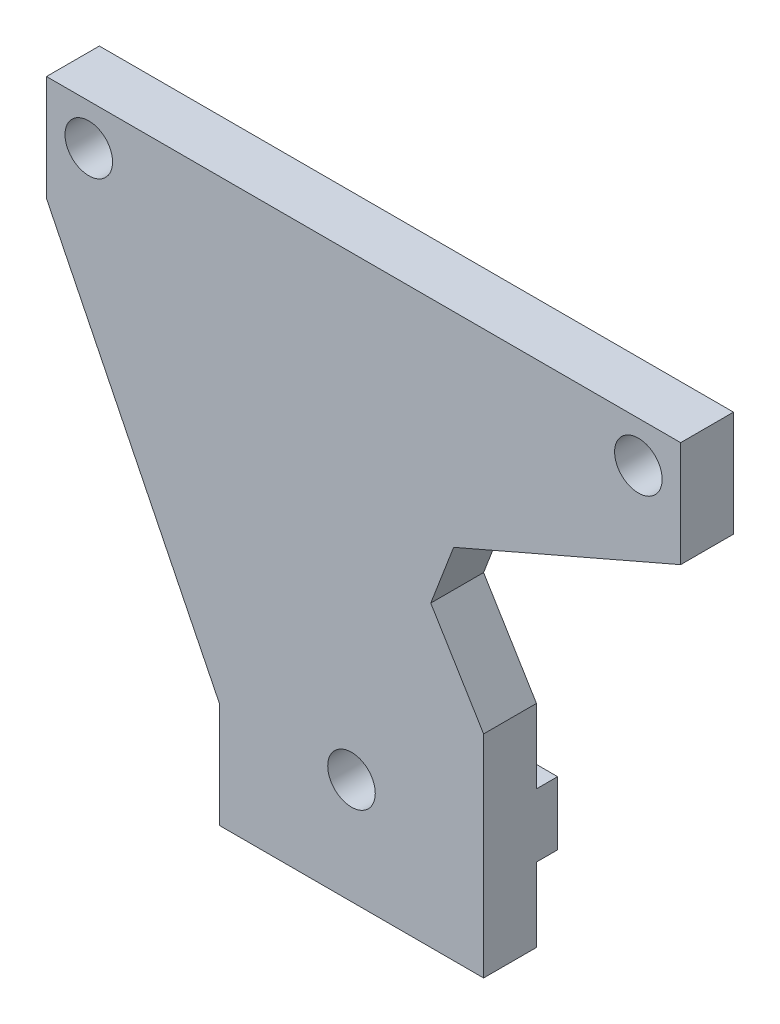
ISO-10303-21;
HEADER;
FILE_DESCRIPTION(('STEP AP214'),'2;1');
FILE_NAME('part.step','',(''),(''),'','','');
FILE_SCHEMA(('AUTOMOTIVE_DESIGN { 1 0 10303 214 1 1 1 1 }'));
ENDSEC;
DATA;
#1=APPLICATION_CONTEXT('core data for automotive mechanical design processes');
#2=APPLICATION_PROTOCOL_DEFINITION('international standard','automotive_design',2000,#1);
#3=PRODUCT_CONTEXT('',#1,'mechanical');
#4=PRODUCT('Part','Part','',(#3));
#5=PRODUCT_RELATED_PRODUCT_CATEGORY('part','',(#4));
#6=PRODUCT_DEFINITION_FORMATION('','',#4);
#7=PRODUCT_DEFINITION_CONTEXT('part definition',#1,'design');
#8=PRODUCT_DEFINITION('design','',#6,#7);
#9=PRODUCT_DEFINITION_SHAPE('','',#8);
#10=(LENGTH_UNIT() NAMED_UNIT(*) SI_UNIT(.MILLI.,.METRE.));
#11=(NAMED_UNIT(*) PLANE_ANGLE_UNIT() SI_UNIT($,.RADIAN.));
#12=(NAMED_UNIT(*) SI_UNIT($,.STERADIAN.) SOLID_ANGLE_UNIT());
#13=UNCERTAINTY_MEASURE_WITH_UNIT(LENGTH_MEASURE(1.E-05),#10,'distance_accuracy_value','');
#14=(GEOMETRIC_REPRESENTATION_CONTEXT(3) GLOBAL_UNCERTAINTY_ASSIGNED_CONTEXT((#13)) GLOBAL_UNIT_ASSIGNED_CONTEXT((#10,
#11,#12)) REPRESENTATION_CONTEXT('',''));
#15=CARTESIAN_POINT('',(0.,0.,0.));
#16=DIRECTION('',(0.,0.,1.));
#17=DIRECTION('',(1.,0.,0.));
#18=AXIS2_PLACEMENT_3D('',#15,#16,#17);
#19=CARTESIAN_POINT('',(0.,0.,0.));
#20=DIRECTION('',(0.,0.,1.));
#21=DIRECTION('',(1.,0.,0.));
#22=AXIS2_PLACEMENT_3D('',#19,#20,#21);
#23=PLANE('',#22);
#24=DIRECTION('',(-1.,0.,0.));
#25=VECTOR('',#24,1.);
#26=CARTESIAN_POINT('',(41.3569249684672,-46.1881154266996,0.));
#27=LINE('',#26,#25);
#28=CARTESIAN_POINT('',(41.3569249684672,-46.1881154266996,0.));
#29=VERTEX_POINT('',#28);
#30=CARTESIAN_POINT('',(16.3569249684672,-46.1881154266996,0.));
#31=VERTEX_POINT('',#30);
#32=EDGE_CURVE('E54',#29,#31,#27,.T.);
#33=ORIENTED_EDGE('',*,*,#32,.F.);
#34=DIRECTION('',(0.,1.,0.));
#35=VECTOR('',#34,1.);
#36=CARTESIAN_POINT('',(41.3569249684672,-53.1881154266996,0.));
#37=LINE('',#36,#35);
#38=CARTESIAN_POINT('',(41.3569249684672,-53.1881154266996,0.));
#39=VERTEX_POINT('',#38);
#40=EDGE_CURVE('E168',#39,#29,#37,.T.);
#41=ORIENTED_EDGE('',*,*,#40,.F.);
#42=DIRECTION('',(1.,0.,0.));
#43=VECTOR('',#42,1.);
#44=CARTESIAN_POINT('',(16.3569249684672,-53.1881154266996,0.));
#45=LINE('',#44,#43);
#46=CARTESIAN_POINT('',(16.3569249684672,-53.1881154266996,0.));
#47=VERTEX_POINT('',#46);
#48=EDGE_CURVE('E165',#47,#39,#45,.T.);
#49=ORIENTED_EDGE('',*,*,#48,.F.);
#50=DIRECTION('',(0.,-1.,0.));
#51=VECTOR('',#50,1.);
#52=CARTESIAN_POINT('',(16.3569249684672,-43.1881154266996,0.));
#53=LINE('',#52,#51);
#54=EDGE_CURVE('E163',#31,#47,#53,.T.);
#55=ORIENTED_EDGE('',*,*,#54,.F.);
#56=EDGE_LOOP('',(#33,#41,#49,#55));
#57=FACE_BOUND('',#56,.T.);
#58=ADVANCED_FACE('F37',(#57),#23,.F.);
#59=CARTESIAN_POINT('',(0.,0.,5.));
#60=DIRECTION('',(1.,0.,0.));
#61=DIRECTION('',(0.,0.,-1.));
#62=AXIS2_PLACEMENT_3D('',#59,#60,#61);
#63=PLANE('',#62);
#64=DIRECTION('',(0.,-1.,0.));
#65=VECTOR('',#64,1.);
#66=CARTESIAN_POINT('',(0.,0.,0.));
#67=LINE('',#66,#65);
#68=CARTESIAN_POINT('',(0.,0.,0.));
#69=VERTEX_POINT('',#68);
#70=CARTESIAN_POINT('',(0.,-10.,0.));
#71=VERTEX_POINT('',#70);
#72=EDGE_CURVE('E156',#69,#71,#67,.T.);
#73=ORIENTED_EDGE('',*,*,#72,.T.);
#74=DIRECTION('',(0.,0.,-1.));
#75=VECTOR('',#74,1.);
#76=CARTESIAN_POINT('',(0.,-10.,5.));
#77=LINE('',#76,#75);
#78=CARTESIAN_POINT('',(0.,-10.,5.));
#79=VERTEX_POINT('',#78);
#80=EDGE_CURVE('E11',#79,#71,#77,.T.);
#81=ORIENTED_EDGE('',*,*,#80,.F.);
#82=DIRECTION('',(0.,-1.,0.));
#83=VECTOR('',#82,1.);
#84=CARTESIAN_POINT('',(0.,0.,5.));
#85=LINE('',#84,#83);
#86=CARTESIAN_POINT('',(0.,0.,5.));
#87=VERTEX_POINT('',#86);
#88=EDGE_CURVE('E179',#87,#79,#85,.T.);
#89=ORIENTED_EDGE('',*,*,#88,.F.);
#90=DIRECTION('',(0.,0.,-1.));
#91=VECTOR('',#90,1.);
#92=CARTESIAN_POINT('',(0.,0.,5.));
#93=LINE('',#92,#91);
#94=EDGE_CURVE('E152',#87,#69,#93,.T.);
#95=ORIENTED_EDGE('',*,*,#94,.T.);
#96=EDGE_LOOP('',(#73,#81,#89,#95));
#97=FACE_BOUND('',#96,.T.);
#98=ADVANCED_FACE('F39',(#97),#63,.F.);
#99=CARTESIAN_POINT('',(0.,-10.,5.));
#100=DIRECTION('',(0.896976092613502,0.442079053201817,0.));
#101=DIRECTION('',(-0.442079053201817,0.896976092613502,0.));
#102=AXIS2_PLACEMENT_3D('',#99,#100,#101);
#103=PLANE('',#102);
#104=DIRECTION('',(0.442079053201817,-0.896976092613502,0.));
#105=VECTOR('',#104,1.);
#106=CARTESIAN_POINT('',(0.,-10.,0.));
#107=LINE('',#106,#105);
#108=CARTESIAN_POINT('',(16.3569249684672,-43.1881154266996,0.));
#109=VERTEX_POINT('',#108);
#110=EDGE_CURVE('E159',#71,#109,#107,.T.);
#111=ORIENTED_EDGE('',*,*,#110,.T.);
#112=DIRECTION('',(0.,0.,-1.));
#113=VECTOR('',#112,1.);
#114=CARTESIAN_POINT('',(16.3569249684672,-43.1881154266996,5.));
#115=LINE('',#114,#113);
#116=CARTESIAN_POINT('',(16.3569249684672,-43.1881154266996,5.));
#117=VERTEX_POINT('',#116);
#118=EDGE_CURVE('E46',#117,#109,#115,.T.);
#119=ORIENTED_EDGE('',*,*,#118,.F.);
#120=DIRECTION('',(0.442079053201817,-0.896976092613502,0.));
#121=VECTOR('',#120,1.);
#122=CARTESIAN_POINT('',(0.,-10.,5.));
#123=LINE('',#122,#121);
#124=EDGE_CURVE('E107',#79,#117,#123,.T.);
#125=ORIENTED_EDGE('',*,*,#124,.F.);
#126=ORIENTED_EDGE('',*,*,#80,.T.);
#127=EDGE_LOOP('',(#111,#119,#125,#126));
#128=FACE_BOUND('',#127,.T.);
#129=ADVANCED_FACE('F272',(#128),#103,.F.);
#130=CARTESIAN_POINT('',(16.3569249684672,-43.1881154266996,5.));
#131=DIRECTION('',(1.,0.,0.));
#132=DIRECTION('',(0.,0.,-1.));
#133=AXIS2_PLACEMENT_3D('',#130,#131,#132);
#134=PLANE('',#133);
#135=ORIENTED_EDGE('',*,*,#118,.T.);
#136=DIRECTION('',(0.,-1.,0.));
#137=VECTOR('',#136,1.);
#138=CARTESIAN_POINT('',(16.3569249684672,-40.1881154266996,0.));
#139=LINE('',#138,#137);
#140=CARTESIAN_POINT('',(16.3569249684672,-40.1881154266996,0.));
#141=VERTEX_POINT('',#140);
#142=EDGE_CURVE('E230',#141,#109,#139,.T.);
#143=ORIENTED_EDGE('',*,*,#142,.F.);
#144=DIRECTION('',(0.,0.,1.));
#145=VECTOR('',#144,1.);
#146=CARTESIAN_POINT('',(16.3569249684672,-40.1881154266996,-2.));
#147=LINE('',#146,#145);
#148=CARTESIAN_POINT('',(16.3569249684672,-40.1881154266996,-2.));
#149=VERTEX_POINT('',#148);
#150=EDGE_CURVE('E239',#149,#141,#147,.T.);
#151=ORIENTED_EDGE('',*,*,#150,.F.);
#152=DIRECTION('',(0.,-1.,0.));
#153=VECTOR('',#152,1.);
#154=CARTESIAN_POINT('',(16.3569249684672,-40.1881154266996,-2.));
#155=LINE('',#154,#153);
#156=CARTESIAN_POINT('',(16.3569249684672,-46.1881154266996,-2.));
#157=VERTEX_POINT('',#156);
#158=EDGE_CURVE('E218',#149,#157,#155,.T.);
#159=ORIENTED_EDGE('',*,*,#158,.T.);
#160=DIRECTION('',(0.,0.,1.));
#161=VECTOR('',#160,1.);
#162=CARTESIAN_POINT('',(16.3569249684672,-46.1881154266996,-2.));
#163=LINE('',#162,#161);
#164=EDGE_CURVE('E160',#157,#31,#163,.T.);
#165=ORIENTED_EDGE('',*,*,#164,.T.);
#166=ORIENTED_EDGE('',*,*,#54,.T.);
#167=DIRECTION('',(0.,0.,-1.));
#168=VECTOR('',#167,1.);
#169=CARTESIAN_POINT('',(16.3569249684672,-53.1881154266996,5.));
#170=LINE('',#169,#168);
#171=CARTESIAN_POINT('',(16.3569249684672,-53.1881154266996,5.));
#172=VERTEX_POINT('',#171);
#173=EDGE_CURVE('E192',#172,#47,#170,.T.);
#174=ORIENTED_EDGE('',*,*,#173,.F.);
#175=DIRECTION('',(0.,-1.,0.));
#176=VECTOR('',#175,1.);
#177=CARTESIAN_POINT('',(16.3569249684672,-43.1881154266996,5.));
#178=LINE('',#177,#176);
#179=EDGE_CURVE('E245',#117,#172,#178,.T.);
#180=ORIENTED_EDGE('',*,*,#179,.F.);
#181=EDGE_LOOP('',(#135,#143,#151,#159,#165,#166,#174,#180));
#182=FACE_BOUND('',#181,.T.);
#183=ADVANCED_FACE('F275',(#182),#134,.F.);
#184=CARTESIAN_POINT('',(16.3569249684672,-53.1881154266996,5.));
#185=DIRECTION('',(0.,1.,0.));
#186=DIRECTION('',(0.,0.,1.));
#187=AXIS2_PLACEMENT_3D('',#184,#185,#186);
#188=PLANE('',#187);
#189=ORIENTED_EDGE('',*,*,#48,.T.);
#190=DIRECTION('',(0.,0.,-1.));
#191=VECTOR('',#190,1.);
#192=CARTESIAN_POINT('',(41.3569249684672,-53.1881154266996,5.));
#193=LINE('',#192,#191);
#194=CARTESIAN_POINT('',(41.3569249684672,-53.1881154266996,5.));
#195=VERTEX_POINT('',#194);
#196=EDGE_CURVE('E189',#195,#39,#193,.T.);
#197=ORIENTED_EDGE('',*,*,#196,.F.);
#198=DIRECTION('',(1.,0.,0.));
#199=VECTOR('',#198,1.);
#200=CARTESIAN_POINT('',(16.3569249684672,-53.1881154266996,5.));
#201=LINE('',#200,#199);
#202=EDGE_CURVE('E247',#172,#195,#201,.T.);
#203=ORIENTED_EDGE('',*,*,#202,.F.);
#204=ORIENTED_EDGE('',*,*,#173,.T.);
#205=EDGE_LOOP('',(#189,#197,#203,#204));
#206=FACE_BOUND('',#205,.T.);
#207=ADVANCED_FACE('F281',(#206),#188,.F.);
#208=CARTESIAN_POINT('',(41.3569249684672,-53.1881154266996,5.));
#209=DIRECTION('',(-1.,0.,0.));
#210=DIRECTION('',(0.,0.,1.));
#211=AXIS2_PLACEMENT_3D('',#208,#209,#210);
#212=PLANE('',#211);
#213=ORIENTED_EDGE('',*,*,#40,.T.);
#214=DIRECTION('',(0.,0.,1.));
#215=VECTOR('',#214,1.);
#216=CARTESIAN_POINT('',(41.3569249684672,-46.1881154266996,-2.));
#217=LINE('',#216,#215);
#218=CARTESIAN_POINT('',(41.3569249684672,-46.1881154266996,-2.));
#219=VERTEX_POINT('',#218);
#220=EDGE_CURVE('E228',#219,#29,#217,.T.);
#221=ORIENTED_EDGE('',*,*,#220,.F.);
#222=DIRECTION('',(0.,-1.,0.));
#223=VECTOR('',#222,1.);
#224=CARTESIAN_POINT('',(41.3569249684672,-40.1881154266996,-2.));
#225=LINE('',#224,#223);
#226=CARTESIAN_POINT('',(41.3569249684672,-40.1881154266996,-2.));
#227=VERTEX_POINT('',#226);
#228=EDGE_CURVE('E225',#227,#219,#225,.T.);
#229=ORIENTED_EDGE('',*,*,#228,.F.);
#230=DIRECTION('',(0.,0.,1.));
#231=VECTOR('',#230,1.);
#232=CARTESIAN_POINT('',(41.3569249684672,-40.1881154266996,-2.));
#233=LINE('',#232,#231);
#234=CARTESIAN_POINT('',(41.3569249684672,-40.1881154266996,0.));
#235=VERTEX_POINT('',#234);
#236=EDGE_CURVE('E236',#227,#235,#233,.T.);
#237=ORIENTED_EDGE('',*,*,#236,.T.);
#238=CARTESIAN_POINT('',(41.3569249684672,-33.1881154266996,0.));
#239=VERTEX_POINT('',#238);
#240=EDGE_CURVE('E167',#235,#239,#37,.T.);
#241=ORIENTED_EDGE('',*,*,#240,.T.);
#242=DIRECTION('',(0.,0.,-1.));
#243=VECTOR('',#242,1.);
#244=CARTESIAN_POINT('',(41.3569249684672,-33.1881154266996,5.));
#245=LINE('',#244,#243);
#246=CARTESIAN_POINT('',(41.3569249684672,-33.1881154266996,5.));
#247=VERTEX_POINT('',#246);
#248=EDGE_CURVE('E186',#247,#239,#245,.T.);
#249=ORIENTED_EDGE('',*,*,#248,.F.);
#250=DIRECTION('',(0.,1.,0.));
#251=VECTOR('',#250,1.);
#252=CARTESIAN_POINT('',(41.3569249684672,-53.1881154266996,5.));
#253=LINE('',#252,#251);
#254=EDGE_CURVE('E249',#195,#247,#253,.T.);
#255=ORIENTED_EDGE('',*,*,#254,.F.);
#256=ORIENTED_EDGE('',*,*,#196,.T.);
#257=EDGE_LOOP('',(#213,#221,#229,#237,#241,#249,#255,#256));
#258=FACE_BOUND('',#257,.T.);
#259=ADVANCED_FACE('F284',(#258),#212,.F.);
#260=CARTESIAN_POINT('',(41.3569249684672,-33.1881154266996,5.));
#261=DIRECTION('',(-0.854310976073864,-0.519762211169417,0.));
#262=DIRECTION('',(0.519762211169417,-0.854310976073864,0.));
#263=AXIS2_PLACEMENT_3D('',#260,#261,#262);
#264=PLANE('',#263);
#265=DIRECTION('',(-0.519762211169417,0.854310976073864,0.));
#266=VECTOR('',#265,1.);
#267=CARTESIAN_POINT('',(41.3569249684672,-33.1881154266996,0.));
#268=LINE('',#267,#266);
#269=CARTESIAN_POINT('',(36.3557169880903,-24.9678431955744,0.));
#270=VERTEX_POINT('',#269);
#271=EDGE_CURVE('E171',#239,#270,#268,.T.);
#272=ORIENTED_EDGE('',*,*,#271,.T.);
#273=DIRECTION('',(0.,0.,-1.));
#274=VECTOR('',#273,1.);
#275=CARTESIAN_POINT('',(36.3557169880903,-24.9678431955744,5.));
#276=LINE('',#275,#274);
#277=CARTESIAN_POINT('',(36.3557169880903,-24.9678431955744,5.));
#278=VERTEX_POINT('',#277);
#279=EDGE_CURVE('E183',#278,#270,#276,.T.);
#280=ORIENTED_EDGE('',*,*,#279,.F.);
#281=DIRECTION('',(-0.519762211169417,0.854310976073864,0.));
#282=VECTOR('',#281,1.);
#283=CARTESIAN_POINT('',(41.3569249684672,-33.1881154266996,5.));
#284=LINE('',#283,#282);
#285=EDGE_CURVE('E251',#247,#278,#284,.T.);
#286=ORIENTED_EDGE('',*,*,#285,.F.);
#287=ORIENTED_EDGE('',*,*,#248,.T.);
#288=EDGE_LOOP('',(#272,#280,#286,#287));
#289=FACE_BOUND('',#288,.T.);
#290=ADVANCED_FACE('F257',(#289),#264,.F.);
#291=CARTESIAN_POINT('',(36.3557169880903,-24.9678431955744,5.));
#292=DIRECTION('',(-0.93374611730205,0.357936011632452,0.));
#293=DIRECTION('',(-0.357936011632452,-0.93374611730205,0.));
#294=AXIS2_PLACEMENT_3D('',#291,#292,#293);
#295=PLANE('',#294);
#296=DIRECTION('',(0.357936011632452,0.93374611730205,0.));
#297=VECTOR('',#296,1.);
#298=CARTESIAN_POINT('',(36.3557169880903,-24.9678431955744,0.));
#299=LINE('',#298,#297);
#300=CARTESIAN_POINT('',(38.5227399227401,-19.3147398877922,0.));
#301=VERTEX_POINT('',#300);
#302=EDGE_CURVE('E173',#270,#301,#299,.T.);
#303=ORIENTED_EDGE('',*,*,#302,.T.);
#304=DIRECTION('',(0.,0.,-1.));
#305=VECTOR('',#304,1.);
#306=CARTESIAN_POINT('',(38.5227399227401,-19.3147398877922,5.));
#307=LINE('',#306,#305);
#308=CARTESIAN_POINT('',(38.5227399227401,-19.3147398877922,5.));
#309=VERTEX_POINT('',#308);
#310=EDGE_CURVE('E147',#309,#301,#307,.T.);
#311=ORIENTED_EDGE('',*,*,#310,.F.);
#312=DIRECTION('',(0.357936011632452,0.93374611730205,0.));
#313=VECTOR('',#312,1.);
#314=CARTESIAN_POINT('',(36.3557169880903,-24.9678431955744,5.));
#315=LINE('',#314,#313);
#316=EDGE_CURVE('E135',#278,#309,#315,.T.);
#317=ORIENTED_EDGE('',*,*,#316,.F.);
#318=ORIENTED_EDGE('',*,*,#279,.T.);
#319=EDGE_LOOP('',(#303,#311,#317,#318));
#320=FACE_BOUND('',#319,.T.);
#321=ADVANCED_FACE('F261',(#320),#295,.F.);
#322=CARTESIAN_POINT('',(38.5227399227401,-19.3147398877922,5.));
#323=DIRECTION('',(-0.397892506464658,0.917432042877984,0.));
#324=DIRECTION('',(-0.917432042877985,-0.397892506464659,0.));
#325=AXIS2_PLACEMENT_3D('',#322,#323,#324);
#326=PLANE('',#325);
#327=DIRECTION('',(0.917432042877984,0.397892506464659,0.));
#328=VECTOR('',#327,1.);
#329=CARTESIAN_POINT('',(38.5227399227401,-19.3147398877922,0.));
#330=LINE('',#329,#328);
#331=CARTESIAN_POINT('',(60.,-10.,0.));
#332=VERTEX_POINT('',#331);
#333=EDGE_CURVE('E144',#301,#332,#330,.T.);
#334=ORIENTED_EDGE('',*,*,#333,.T.);
#335=DIRECTION('',(0.,0.,-1.));
#336=VECTOR('',#335,1.);
#337=CARTESIAN_POINT('',(60.,-10.,5.));
#338=LINE('',#337,#336);
#339=CARTESIAN_POINT('',(60.,-10.,5.));
#340=VERTEX_POINT('',#339);
#341=EDGE_CURVE('E141',#340,#332,#338,.T.);
#342=ORIENTED_EDGE('',*,*,#341,.F.);
#343=DIRECTION('',(0.917432042877984,0.397892506464659,0.));
#344=VECTOR('',#343,1.);
#345=CARTESIAN_POINT('',(38.5227399227401,-19.3147398877922,5.));
#346=LINE('',#345,#344);
#347=EDGE_CURVE('E128',#309,#340,#346,.T.);
#348=ORIENTED_EDGE('',*,*,#347,.F.);
#349=ORIENTED_EDGE('',*,*,#310,.T.);
#350=EDGE_LOOP('',(#334,#342,#348,#349));
#351=FACE_BOUND('',#350,.T.);
#352=ADVANCED_FACE('F142',(#351),#326,.F.);
#353=CARTESIAN_POINT('',(60.,0.,5.));
#354=DIRECTION('',(-1.,0.,0.));
#355=DIRECTION('',(0.,0.,1.));
#356=AXIS2_PLACEMENT_3D('',#353,#354,#355);
#357=PLANE('',#356);
#358=DIRECTION('',(0.,1.,0.));
#359=VECTOR('',#358,1.);
#360=CARTESIAN_POINT('',(60.,0.,0.));
#361=LINE('',#360,#359);
#362=CARTESIAN_POINT('',(60.,0.,0.));
#363=VERTEX_POINT('',#362);
#364=EDGE_CURVE('E176',#332,#363,#361,.T.);
#365=ORIENTED_EDGE('',*,*,#364,.T.);
#366=DIRECTION('',(0.,0.,-1.));
#367=VECTOR('',#366,1.);
#368=CARTESIAN_POINT('',(60.,0.,5.));
#369=LINE('',#368,#367);
#370=CARTESIAN_POINT('',(60.,0.,5.));
#371=VERTEX_POINT('',#370);
#372=EDGE_CURVE('E148',#371,#363,#369,.T.);
#373=ORIENTED_EDGE('',*,*,#372,.F.);
#374=DIRECTION('',(0.,1.,0.));
#375=VECTOR('',#374,1.);
#376=CARTESIAN_POINT('',(60.,0.,5.));
#377=LINE('',#376,#375);
#378=EDGE_CURVE('E132',#340,#371,#377,.T.);
#379=ORIENTED_EDGE('',*,*,#378,.F.);
#380=ORIENTED_EDGE('',*,*,#341,.T.);
#381=EDGE_LOOP('',(#365,#373,#379,#380));
#382=FACE_BOUND('',#381,.T.);
#383=ADVANCED_FACE('F150',(#382),#357,.F.);
#384=CARTESIAN_POINT('',(0.,0.,5.));
#385=DIRECTION('',(0.,-1.,0.));
#386=DIRECTION('',(0.,0.,-1.));
#387=AXIS2_PLACEMENT_3D('',#384,#385,#386);
#388=PLANE('',#387);
#389=DIRECTION('',(-1.,0.,0.));
#390=VECTOR('',#389,1.);
#391=CARTESIAN_POINT('',(0.,0.,0.));
#392=LINE('',#391,#390);
#393=EDGE_CURVE('E99',#363,#69,#392,.T.);
#394=ORIENTED_EDGE('',*,*,#393,.T.);
#395=ORIENTED_EDGE('',*,*,#94,.F.);
#396=DIRECTION('',(-1.,0.,0.));
#397=VECTOR('',#396,1.);
#398=CARTESIAN_POINT('',(0.,0.,5.));
#399=LINE('',#398,#397);
#400=EDGE_CURVE('E63',#371,#87,#399,.T.);
#401=ORIENTED_EDGE('',*,*,#400,.F.);
#402=ORIENTED_EDGE('',*,*,#372,.T.);
#403=EDGE_LOOP('',(#394,#395,#401,#402));
#404=FACE_BOUND('',#403,.T.);
#405=ADVANCED_FACE('F266',(#404),#388,.F.);
#406=CARTESIAN_POINT('',(0.,0.,5.));
#407=DIRECTION('',(0.,0.,1.));
#408=DIRECTION('',(1.,0.,0.));
#409=AXIS2_PLACEMENT_3D('',#406,#407,#408);
#410=PLANE('',#409);
#411=CARTESIAN_POINT('',(56.,-3.88,5.));
#412=DIRECTION('',(0.,0.,1.));
#413=DIRECTION('',(1.,0.,0.));
#414=AXIS2_PLACEMENT_3D('',#411,#412,#413);
#415=CIRCLE('',#414,2.25);
#416=CARTESIAN_POINT('',(58.25,-3.88,5.));
#417=VERTEX_POINT('',#416);
#418=EDGE_CURVE('E212',#417,#417,#415,.T.);
#419=ORIENTED_EDGE('',*,*,#418,.F.);
#420=EDGE_LOOP('',(#419));
#421=FACE_BOUND('',#420,.T.);
#422=CARTESIAN_POINT('',(4.,-3.88,5.));
#423=DIRECTION('',(0.,0.,1.));
#424=DIRECTION('',(1.,0.,0.));
#425=AXIS2_PLACEMENT_3D('',#422,#423,#424);
#426=CIRCLE('',#425,2.25);
#427=CARTESIAN_POINT('',(6.25,-3.88,5.));
#428=VERTEX_POINT('',#427);
#429=EDGE_CURVE('E198',#428,#428,#426,.T.);
#430=ORIENTED_EDGE('',*,*,#429,.F.);
#431=EDGE_LOOP('',(#430));
#432=FACE_BOUND('',#431,.T.);
#433=CARTESIAN_POINT('',(28.8569249684672,-43.1881154266996,5.));
#434=DIRECTION('',(0.,0.,1.));
#435=DIRECTION('',(1.,0.,0.));
#436=AXIS2_PLACEMENT_3D('',#433,#434,#435);
#437=CIRCLE('',#436,2.25);
#438=CARTESIAN_POINT('',(31.1069249684672,-43.1881154266996,5.));
#439=VERTEX_POINT('',#438);
#440=EDGE_CURVE('E199',#439,#439,#437,.T.);
#441=ORIENTED_EDGE('',*,*,#440,.F.);
#442=EDGE_LOOP('',(#441));
#443=FACE_BOUND('',#442,.T.);
#444=ORIENTED_EDGE('',*,*,#88,.T.);
#445=ORIENTED_EDGE('',*,*,#124,.T.);
#446=ORIENTED_EDGE('',*,*,#179,.T.);
#447=ORIENTED_EDGE('',*,*,#202,.T.);
#448=ORIENTED_EDGE('',*,*,#254,.T.);
#449=ORIENTED_EDGE('',*,*,#285,.T.);
#450=ORIENTED_EDGE('',*,*,#316,.T.);
#451=ORIENTED_EDGE('',*,*,#347,.T.);
#452=ORIENTED_EDGE('',*,*,#378,.T.);
#453=ORIENTED_EDGE('',*,*,#400,.T.);
#454=EDGE_LOOP('',(#444,#445,#446,#447,#448,#449,#450,#451,#452,#453));
#455=FACE_BOUND('',#454,.T.);
#456=ADVANCED_FACE('F130',(#421,#432,#443,#455),#410,.T.);
#457=CARTESIAN_POINT('',(56.,-3.88,0.));
#458=DIRECTION('',(0.,0.,1.));
#459=DIRECTION('',(1.,0.,0.));
#460=AXIS2_PLACEMENT_3D('',#457,#458,#459);
#461=CIRCLE('',#460,2.25);
#462=CARTESIAN_POINT('',(58.25,-3.88,0.));
#463=VERTEX_POINT('',#462);
#464=EDGE_CURVE('E41',#463,#463,#461,.T.);
#465=ORIENTED_EDGE('',*,*,#464,.T.);
#466=EDGE_LOOP('',(#465));
#467=FACE_BOUND('',#466,.T.);
#468=CARTESIAN_POINT('',(4.,-3.88,0.));
#469=DIRECTION('',(0.,0.,1.));
#470=DIRECTION('',(1.,0.,0.));
#471=AXIS2_PLACEMENT_3D('',#468,#469,#470);
#472=CIRCLE('',#471,2.25);
#473=CARTESIAN_POINT('',(6.25,-3.88,0.));
#474=VERTEX_POINT('',#473);
#475=EDGE_CURVE('E196',#474,#474,#472,.T.);
#476=ORIENTED_EDGE('',*,*,#475,.T.);
#477=EDGE_LOOP('',(#476));
#478=FACE_BOUND('',#477,.T.);
#479=ORIENTED_EDGE('',*,*,#240,.F.);
#480=DIRECTION('',(-1.,0.,0.));
#481=VECTOR('',#480,1.);
#482=CARTESIAN_POINT('',(41.3569249684672,-40.1881154266996,0.));
#483=LINE('',#482,#481);
#484=EDGE_CURVE('E219',#235,#141,#483,.T.);
#485=ORIENTED_EDGE('',*,*,#484,.T.);
#486=ORIENTED_EDGE('',*,*,#142,.T.);
#487=ORIENTED_EDGE('',*,*,#110,.F.);
#488=ORIENTED_EDGE('',*,*,#72,.F.);
#489=ORIENTED_EDGE('',*,*,#393,.F.);
#490=ORIENTED_EDGE('',*,*,#364,.F.);
#491=ORIENTED_EDGE('',*,*,#333,.F.);
#492=ORIENTED_EDGE('',*,*,#302,.F.);
#493=ORIENTED_EDGE('',*,*,#271,.F.);
#494=EDGE_LOOP('',(#479,#485,#486,#487,#488,#489,#490,#491,#492,#493));
#495=FACE_BOUND('',#494,.T.);
#496=ADVANCED_FACE('F264',(#467,#478,#495),#23,.F.);
#497=CARTESIAN_POINT('',(41.3569249684672,-46.1881154266996,-2.));
#498=DIRECTION('',(0.,1.,0.));
#499=DIRECTION('',(0.,0.,1.));
#500=AXIS2_PLACEMENT_3D('',#497,#498,#499);
#501=PLANE('',#500);
#502=ORIENTED_EDGE('',*,*,#32,.T.);
#503=ORIENTED_EDGE('',*,*,#164,.F.);
#504=DIRECTION('',(-1.,0.,0.));
#505=VECTOR('',#504,1.);
#506=CARTESIAN_POINT('',(41.3569249684672,-46.1881154266996,-2.));
#507=LINE('',#506,#505);
#508=EDGE_CURVE('E215',#219,#157,#507,.T.);
#509=ORIENTED_EDGE('',*,*,#508,.F.);
#510=ORIENTED_EDGE('',*,*,#220,.T.);
#511=EDGE_LOOP('',(#502,#503,#509,#510));
#512=FACE_BOUND('',#511,.T.);
#513=ADVANCED_FACE('F308',(#512),#501,.F.);
#514=CARTESIAN_POINT('',(41.3569249684672,-40.1881154266996,-2.));
#515=DIRECTION('',(0.,1.,0.));
#516=DIRECTION('',(0.,0.,1.));
#517=AXIS2_PLACEMENT_3D('',#514,#515,#516);
#518=PLANE('',#517);
#519=ORIENTED_EDGE('',*,*,#484,.F.);
#520=ORIENTED_EDGE('',*,*,#236,.F.);
#521=DIRECTION('',(-1.,0.,0.));
#522=VECTOR('',#521,1.);
#523=CARTESIAN_POINT('',(41.3569249684672,-40.1881154266996,-2.));
#524=LINE('',#523,#522);
#525=EDGE_CURVE('E222',#227,#149,#524,.T.);
#526=ORIENTED_EDGE('',*,*,#525,.T.);
#527=ORIENTED_EDGE('',*,*,#150,.T.);
#528=EDGE_LOOP('',(#519,#520,#526,#527));
#529=FACE_BOUND('',#528,.T.);
#530=ADVANCED_FACE('F310',(#529),#518,.T.);
#531=CARTESIAN_POINT('',(0.,0.,-2.));
#532=DIRECTION('',(0.,0.,1.));
#533=DIRECTION('',(1.,0.,0.));
#534=AXIS2_PLACEMENT_3D('',#531,#532,#533);
#535=PLANE('',#534);
#536=CARTESIAN_POINT('',(28.8569249684672,-43.1881154266996,-2.));
#537=DIRECTION('',(0.,0.,-1.));
#538=DIRECTION('',(-1.,0.,0.));
#539=AXIS2_PLACEMENT_3D('',#536,#537,#538);
#540=CIRCLE('',#539,2.25);
#541=CARTESIAN_POINT('',(26.6069249684672,-43.1881154266996,-2.));
#542=VERTEX_POINT('',#541);
#543=EDGE_CURVE('E205',#542,#542,#540,.T.);
#544=ORIENTED_EDGE('',*,*,#543,.F.);
#545=EDGE_LOOP('',(#544));
#546=FACE_BOUND('',#545,.T.);
#547=ORIENTED_EDGE('',*,*,#508,.T.);
#548=ORIENTED_EDGE('',*,*,#158,.F.);
#549=ORIENTED_EDGE('',*,*,#525,.F.);
#550=ORIENTED_EDGE('',*,*,#228,.T.);
#551=EDGE_LOOP('',(#547,#548,#549,#550));
#552=FACE_BOUND('',#551,.T.);
#553=ADVANCED_FACE('F305',(#546,#552),#535,.F.);
#554=CARTESIAN_POINT('',(28.8569249684672,-43.1881154266996,6.1));
#555=DIRECTION('',(0.,0.,-1.));
#556=DIRECTION('',(-1.,0.,0.));
#557=AXIS2_PLACEMENT_3D('',#554,#555,#556);
#558=CYLINDRICAL_SURFACE('',#557,2.25);
#559=ORIENTED_EDGE('',*,*,#440,.T.);
#560=EDGE_LOOP('',(#559));
#561=FACE_BOUND('',#560,.T.);
#562=ORIENTED_EDGE('',*,*,#543,.T.);
#563=EDGE_LOOP('',(#562));
#564=FACE_BOUND('',#563,.T.);
#565=ADVANCED_FACE('F338',(#561,#564),#558,.F.);
#566=CARTESIAN_POINT('',(4.,-3.88,6.1));
#567=DIRECTION('',(0.,0.,-1.));
#568=DIRECTION('',(-1.,0.,0.));
#569=AXIS2_PLACEMENT_3D('',#566,#567,#568);
#570=CYLINDRICAL_SURFACE('',#569,2.25);
#571=ORIENTED_EDGE('',*,*,#429,.T.);
#572=EDGE_LOOP('',(#571));
#573=FACE_BOUND('',#572,.T.);
#574=ORIENTED_EDGE('',*,*,#475,.F.);
#575=EDGE_LOOP('',(#574));
#576=FACE_BOUND('',#575,.T.);
#577=ADVANCED_FACE('F332',(#573,#576),#570,.F.);
#578=CARTESIAN_POINT('',(56.,-3.88,6.1));
#579=DIRECTION('',(0.,0.,-1.));
#580=DIRECTION('',(-1.,0.,0.));
#581=AXIS2_PLACEMENT_3D('',#578,#579,#580);
#582=CYLINDRICAL_SURFACE('',#581,2.25);
#583=ORIENTED_EDGE('',*,*,#418,.T.);
#584=EDGE_LOOP('',(#583));
#585=FACE_BOUND('',#584,.T.);
#586=ORIENTED_EDGE('',*,*,#464,.F.);
#587=EDGE_LOOP('',(#586));
#588=FACE_BOUND('',#587,.T.);
#589=ADVANCED_FACE('F330',(#585,#588),#582,.F.);
#590=CLOSED_SHELL('',(#58,#98,#129,#183,#207,#259,#290,#321,#352,#383,#405,#456,#496,#513,#530,
#553,#565,#577,#589));
#591=MANIFOLD_SOLID_BREP('B2',#590);
#592=ADVANCED_BREP_SHAPE_REPRESENTATION('',(#18,#591),#14);
#593=SHAPE_DEFINITION_REPRESENTATION(#9,#592);
ENDSEC;
END-ISO-10303-21;
